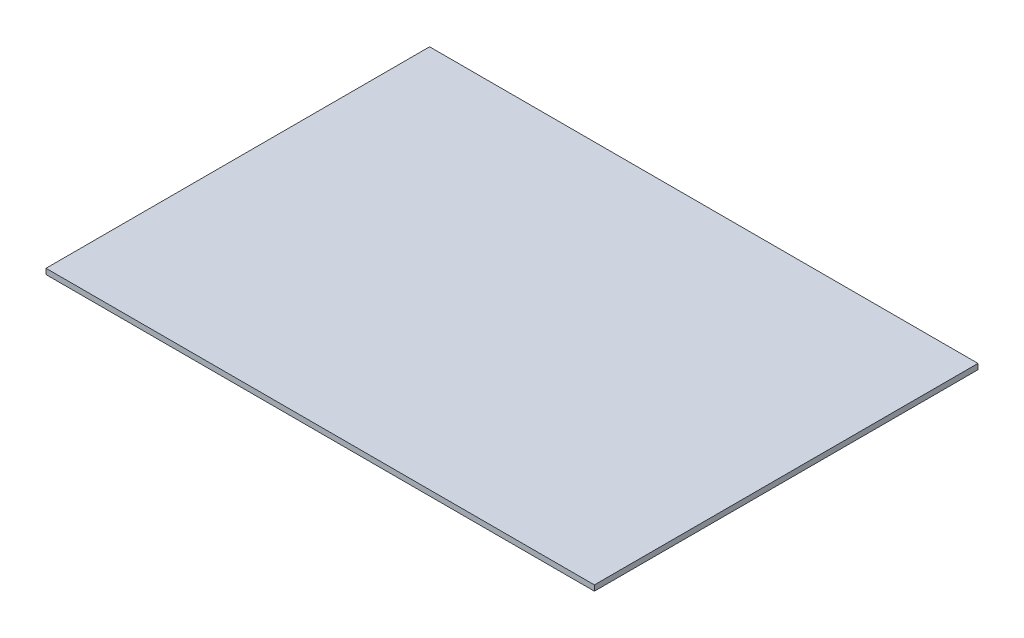
ISO-10303-21;
HEADER;
FILE_DESCRIPTION(('STEP AP214'),'2;1');
FILE_NAME('part.step','',(''),(''),'','','');
FILE_SCHEMA(('AUTOMOTIVE_DESIGN { 1 0 10303 214 1 1 1 1 }'));
ENDSEC;
DATA;
#1=APPLICATION_CONTEXT('core data for automotive mechanical design processes');
#2=APPLICATION_PROTOCOL_DEFINITION('international standard','automotive_design',2000,#1);
#3=PRODUCT_CONTEXT('',#1,'mechanical');
#4=PRODUCT('Part','Part','',(#3));
#5=PRODUCT_RELATED_PRODUCT_CATEGORY('part','',(#4));
#6=PRODUCT_DEFINITION_FORMATION('','',#4);
#7=PRODUCT_DEFINITION_CONTEXT('part definition',#1,'design');
#8=PRODUCT_DEFINITION('design','',#6,#7);
#9=PRODUCT_DEFINITION_SHAPE('','',#8);
#10=(LENGTH_UNIT() NAMED_UNIT(*) SI_UNIT(.MILLI.,.METRE.));
#11=(NAMED_UNIT(*) PLANE_ANGLE_UNIT() SI_UNIT($,.RADIAN.));
#12=(NAMED_UNIT(*) SI_UNIT($,.STERADIAN.) SOLID_ANGLE_UNIT());
#13=UNCERTAINTY_MEASURE_WITH_UNIT(LENGTH_MEASURE(1.E-05),#10,'distance_accuracy_value','');
#14=(GEOMETRIC_REPRESENTATION_CONTEXT(3) GLOBAL_UNCERTAINTY_ASSIGNED_CONTEXT((#13)) GLOBAL_UNIT_ASSIGNED_CONTEXT((#10,
#11,#12)) REPRESENTATION_CONTEXT('',''));
#15=CARTESIAN_POINT('',(0.,0.,0.));
#16=DIRECTION('',(0.,0.,1.));
#17=DIRECTION('',(1.,0.,0.));
#18=AXIS2_PLACEMENT_3D('',#15,#16,#17);
#19=CARTESIAN_POINT('',(0.,10.,349.2));
#20=DIRECTION('',(0.,0.,-1.));
#21=DIRECTION('',(-1.,0.,0.));
#22=AXIS2_PLACEMENT_3D('',#19,#20,#21);
#23=PLANE('',#22);
#24=DIRECTION('',(1.,0.,0.));
#25=VECTOR('',#24,1.);
#26=CARTESIAN_POINT('',(0.,0.,349.2));
#27=LINE('',#26,#25);
#28=CARTESIAN_POINT('',(-448.4,0.,349.2));
#29=VERTEX_POINT('',#28);
#30=CARTESIAN_POINT('',(550.,0.,349.2));
#31=VERTEX_POINT('',#30);
#32=EDGE_CURVE('E108',#29,#31,#27,.T.);
#33=ORIENTED_EDGE('',*,*,#32,.T.);
#34=DIRECTION('',(0.,-1.,0.));
#35=VECTOR('',#34,1.);
#36=CARTESIAN_POINT('',(550.,10.,349.2));
#37=LINE('',#36,#35);
#38=CARTESIAN_POINT('',(550.,10.,349.2));
#39=VERTEX_POINT('',#38);
#40=EDGE_CURVE('E11',#39,#31,#37,.T.);
#41=ORIENTED_EDGE('',*,*,#40,.F.);
#42=DIRECTION('',(1.,0.,0.));
#43=VECTOR('',#42,1.);
#44=CARTESIAN_POINT('',(0.,10.,349.2));
#45=LINE('',#44,#43);
#46=CARTESIAN_POINT('',(-448.4,10.,349.2));
#47=VERTEX_POINT('',#46);
#48=EDGE_CURVE('E81',#47,#39,#45,.T.);
#49=ORIENTED_EDGE('',*,*,#48,.F.);
#50=DIRECTION('',(0.,-1.,0.));
#51=VECTOR('',#50,1.);
#52=CARTESIAN_POINT('',(-448.4,10.,349.2));
#53=LINE('',#52,#51);
#54=EDGE_CURVE('E104',#47,#29,#53,.T.);
#55=ORIENTED_EDGE('',*,*,#54,.T.);
#56=EDGE_LOOP('',(#33,#41,#49,#55));
#57=FACE_BOUND('',#56,.T.);
#58=ADVANCED_FACE('F41',(#57),#23,.F.);
#59=CARTESIAN_POINT('',(550.,10.,0.));
#60=DIRECTION('',(1.,0.,0.));
#61=DIRECTION('',(0.,0.,-1.));
#62=AXIS2_PLACEMENT_3D('',#59,#60,#61);
#63=PLANE('',#62);
#64=DIRECTION('',(0.,0.,1.));
#65=VECTOR('',#64,1.);
#66=CARTESIAN_POINT('',(550.,0.,0.));
#67=LINE('',#66,#65);
#68=CARTESIAN_POINT('',(550.,0.,-349.2));
#69=VERTEX_POINT('',#68);
#70=EDGE_CURVE('E90',#69,#31,#67,.T.);
#71=ORIENTED_EDGE('',*,*,#70,.F.);
#72=DIRECTION('',(0.,-1.,0.));
#73=VECTOR('',#72,1.);
#74=CARTESIAN_POINT('',(550.,10.,-349.2));
#75=LINE('',#74,#73);
#76=CARTESIAN_POINT('',(550.,10.,-349.2));
#77=VERTEX_POINT('',#76);
#78=EDGE_CURVE('E50',#77,#69,#75,.T.);
#79=ORIENTED_EDGE('',*,*,#78,.F.);
#80=DIRECTION('',(0.,0.,1.));
#81=VECTOR('',#80,1.);
#82=CARTESIAN_POINT('',(550.,10.,0.));
#83=LINE('',#82,#81);
#84=EDGE_CURVE('E88',#77,#39,#83,.T.);
#85=ORIENTED_EDGE('',*,*,#84,.T.);
#86=ORIENTED_EDGE('',*,*,#40,.T.);
#87=EDGE_LOOP('',(#71,#79,#85,#86));
#88=FACE_BOUND('',#87,.T.);
#89=ADVANCED_FACE('F87',(#88),#63,.T.);
#90=CARTESIAN_POINT('',(0.,10.,-349.2));
#91=DIRECTION('',(0.,0.,-1.));
#92=DIRECTION('',(-1.,0.,0.));
#93=AXIS2_PLACEMENT_3D('',#90,#91,#92);
#94=PLANE('',#93);
#95=DIRECTION('',(1.,0.,0.));
#96=VECTOR('',#95,1.);
#97=CARTESIAN_POINT('',(0.,0.,-349.2));
#98=LINE('',#97,#96);
#99=CARTESIAN_POINT('',(-448.4,0.,-349.2));
#100=VERTEX_POINT('',#99);
#101=EDGE_CURVE('E114',#100,#69,#98,.T.);
#102=ORIENTED_EDGE('',*,*,#101,.F.);
#103=DIRECTION('',(0.,-1.,0.));
#104=VECTOR('',#103,1.);
#105=CARTESIAN_POINT('',(-448.4,10.,-349.2));
#106=LINE('',#105,#104);
#107=CARTESIAN_POINT('',(-448.4,10.,-349.2));
#108=VERTEX_POINT('',#107);
#109=EDGE_CURVE('E73',#108,#100,#106,.T.);
#110=ORIENTED_EDGE('',*,*,#109,.F.);
#111=DIRECTION('',(1.,0.,0.));
#112=VECTOR('',#111,1.);
#113=CARTESIAN_POINT('',(0.,10.,-349.2));
#114=LINE('',#113,#112);
#115=EDGE_CURVE('E97',#108,#77,#114,.T.);
#116=ORIENTED_EDGE('',*,*,#115,.T.);
#117=ORIENTED_EDGE('',*,*,#78,.T.);
#118=EDGE_LOOP('',(#102,#110,#116,#117));
#119=FACE_BOUND('',#118,.T.);
#120=ADVANCED_FACE('F100',(#119),#94,.T.);
#121=CARTESIAN_POINT('',(-448.4,10.,0.));
#122=DIRECTION('',(1.,0.,0.));
#123=DIRECTION('',(0.,0.,-1.));
#124=AXIS2_PLACEMENT_3D('',#121,#122,#123);
#125=PLANE('',#124);
#126=DIRECTION('',(0.,0.,1.));
#127=VECTOR('',#126,1.);
#128=CARTESIAN_POINT('',(-448.4,0.,0.));
#129=LINE('',#128,#127);
#130=EDGE_CURVE('E76',#100,#29,#129,.T.);
#131=ORIENTED_EDGE('',*,*,#130,.T.);
#132=ORIENTED_EDGE('',*,*,#54,.F.);
#133=DIRECTION('',(0.,0.,1.));
#134=VECTOR('',#133,1.);
#135=CARTESIAN_POINT('',(-448.4,10.,0.));
#136=LINE('',#135,#134);
#137=EDGE_CURVE('E58',#108,#47,#136,.T.);
#138=ORIENTED_EDGE('',*,*,#137,.F.);
#139=ORIENTED_EDGE('',*,*,#109,.T.);
#140=EDGE_LOOP('',(#131,#132,#138,#139));
#141=FACE_BOUND('',#140,.T.);
#142=ADVANCED_FACE('F131',(#141),#125,.F.);
#143=CARTESIAN_POINT('',(0.,10.,0.));
#144=DIRECTION('',(0.,1.,0.));
#145=DIRECTION('',(0.,0.,1.));
#146=AXIS2_PLACEMENT_3D('',#143,#144,#145);
#147=PLANE('',#146);
#148=ORIENTED_EDGE('',*,*,#48,.T.);
#149=ORIENTED_EDGE('',*,*,#84,.F.);
#150=ORIENTED_EDGE('',*,*,#115,.F.);
#151=ORIENTED_EDGE('',*,*,#137,.T.);
#152=EDGE_LOOP('',(#148,#149,#150,#151));
#153=FACE_BOUND('',#152,.T.);
#154=ADVANCED_FACE('F96',(#153),#147,.T.);
#155=CARTESIAN_POINT('',(0.,0.,0.));
#156=DIRECTION('',(0.,1.,0.));
#157=DIRECTION('',(0.,0.,1.));
#158=AXIS2_PLACEMENT_3D('',#155,#156,#157);
#159=PLANE('',#158);
#160=ORIENTED_EDGE('',*,*,#32,.F.);
#161=ORIENTED_EDGE('',*,*,#130,.F.);
#162=ORIENTED_EDGE('',*,*,#101,.T.);
#163=ORIENTED_EDGE('',*,*,#70,.T.);
#164=EDGE_LOOP('',(#160,#161,#162,#163));
#165=FACE_BOUND('',#164,.T.);
#166=ADVANCED_FACE('F125',(#165),#159,.F.);
#167=CLOSED_SHELL('',(#58,#89,#120,#142,#154,#166));
#168=MANIFOLD_SOLID_BREP('B2',#167);
#169=ADVANCED_BREP_SHAPE_REPRESENTATION('',(#18,#168),#14);
#170=SHAPE_DEFINITION_REPRESENTATION(#9,#169);
ENDSEC;
END-ISO-10303-21;
